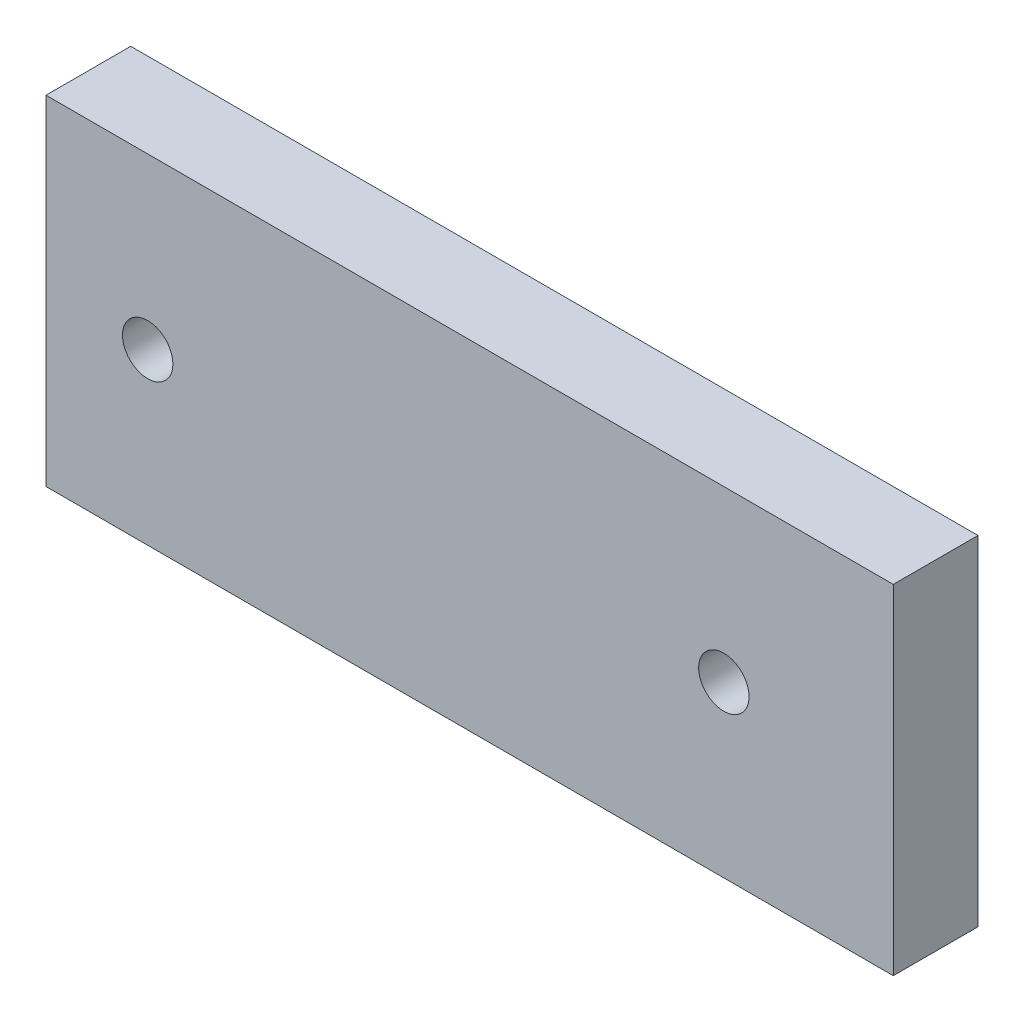
ISO-10303-21;
HEADER;
FILE_DESCRIPTION(('STEP AP214'),'2;1');
FILE_NAME('part.step','',(''),(''),'','','');
FILE_SCHEMA(('AUTOMOTIVE_DESIGN { 1 0 10303 214 1 1 1 1 }'));
ENDSEC;
DATA;
#1=APPLICATION_CONTEXT('core data for automotive mechanical design processes');
#2=APPLICATION_PROTOCOL_DEFINITION('international standard','automotive_design',2000,#1);
#3=PRODUCT_CONTEXT('',#1,'mechanical');
#4=PRODUCT('Part','Part','',(#3));
#5=PRODUCT_RELATED_PRODUCT_CATEGORY('part','',(#4));
#6=PRODUCT_DEFINITION_FORMATION('','',#4);
#7=PRODUCT_DEFINITION_CONTEXT('part definition',#1,'design');
#8=PRODUCT_DEFINITION('design','',#6,#7);
#9=PRODUCT_DEFINITION_SHAPE('','',#8);
#10=(LENGTH_UNIT() NAMED_UNIT(*) SI_UNIT(.MILLI.,.METRE.));
#11=(NAMED_UNIT(*) PLANE_ANGLE_UNIT() SI_UNIT($,.RADIAN.));
#12=(NAMED_UNIT(*) SI_UNIT($,.STERADIAN.) SOLID_ANGLE_UNIT());
#13=UNCERTAINTY_MEASURE_WITH_UNIT(LENGTH_MEASURE(1.E-05),#10,'distance_accuracy_value','');
#14=(GEOMETRIC_REPRESENTATION_CONTEXT(3) GLOBAL_UNCERTAINTY_ASSIGNED_CONTEXT((#13)) GLOBAL_UNIT_ASSIGNED_CONTEXT((#10,
#11,#12)) REPRESENTATION_CONTEXT('',''));
#15=CARTESIAN_POINT('',(0.,0.,0.));
#16=DIRECTION('',(0.,0.,1.));
#17=DIRECTION('',(1.,0.,0.));
#18=AXIS2_PLACEMENT_3D('',#15,#16,#17);
#19=CARTESIAN_POINT('',(-25.,10.,-5.));
#20=DIRECTION('',(-1.,0.,0.));
#21=DIRECTION('',(0.,0.,1.));
#22=AXIS2_PLACEMENT_3D('',#19,#20,#21);
#23=PLANE('',#22);
#24=DIRECTION('',(0.,-1.,0.));
#25=VECTOR('',#24,1.);
#26=CARTESIAN_POINT('',(-25.,10.,0.));
#27=LINE('',#26,#25);
#28=CARTESIAN_POINT('',(-25.,10.,0.));
#29=VERTEX_POINT('',#28);
#30=CARTESIAN_POINT('',(-25.,-10.,0.));
#31=VERTEX_POINT('',#30);
#32=EDGE_CURVE('E98',#29,#31,#27,.T.);
#33=ORIENTED_EDGE('',*,*,#32,.F.);
#34=DIRECTION('',(0.,0.,1.));
#35=VECTOR('',#34,1.);
#36=CARTESIAN_POINT('',(-25.,10.,-5.));
#37=LINE('',#36,#35);
#38=CARTESIAN_POINT('',(-25.,10.,-5.));
#39=VERTEX_POINT('',#38);
#40=EDGE_CURVE('E11',#39,#29,#37,.T.);
#41=ORIENTED_EDGE('',*,*,#40,.F.);
#42=DIRECTION('',(0.,-1.,0.));
#43=VECTOR('',#42,1.);
#44=CARTESIAN_POINT('',(-25.,10.,-5.));
#45=LINE('',#44,#43);
#46=CARTESIAN_POINT('',(-25.,-10.,-5.));
#47=VERTEX_POINT('',#46);
#48=EDGE_CURVE('E91',#39,#47,#45,.T.);
#49=ORIENTED_EDGE('',*,*,#48,.T.);
#50=DIRECTION('',(0.,0.,1.));
#51=VECTOR('',#50,1.);
#52=CARTESIAN_POINT('',(-25.,-10.,-5.));
#53=LINE('',#52,#51);
#54=EDGE_CURVE('E36',#47,#31,#53,.T.);
#55=ORIENTED_EDGE('',*,*,#54,.T.);
#56=EDGE_LOOP('',(#33,#41,#49,#55));
#57=FACE_BOUND('',#56,.T.);
#58=ADVANCED_FACE('F33',(#57),#23,.T.);
#59=CARTESIAN_POINT('',(-25.,10.,-5.));
#60=DIRECTION('',(0.,1.,0.));
#61=DIRECTION('',(-1.,0.,0.));
#62=AXIS2_PLACEMENT_3D('',#59,#60,#61);
#63=PLANE('',#62);
#64=DIRECTION('',(-1.,0.,0.));
#65=VECTOR('',#64,1.);
#66=CARTESIAN_POINT('',(-25.,10.,0.));
#67=LINE('',#66,#65);
#68=CARTESIAN_POINT('',(25.,10.,0.));
#69=VERTEX_POINT('',#68);
#70=EDGE_CURVE('E93',#69,#29,#67,.T.);
#71=ORIENTED_EDGE('',*,*,#70,.F.);
#72=DIRECTION('',(0.,0.,1.));
#73=VECTOR('',#72,1.);
#74=CARTESIAN_POINT('',(25.,10.,-5.));
#75=LINE('',#74,#73);
#76=CARTESIAN_POINT('',(25.,10.,-5.));
#77=VERTEX_POINT('',#76);
#78=EDGE_CURVE('E42',#77,#69,#75,.T.);
#79=ORIENTED_EDGE('',*,*,#78,.F.);
#80=DIRECTION('',(-1.,0.,0.));
#81=VECTOR('',#80,1.);
#82=CARTESIAN_POINT('',(-25.,10.,-5.));
#83=LINE('',#82,#81);
#84=EDGE_CURVE('E88',#77,#39,#83,.T.);
#85=ORIENTED_EDGE('',*,*,#84,.T.);
#86=ORIENTED_EDGE('',*,*,#40,.T.);
#87=EDGE_LOOP('',(#71,#79,#85,#86));
#88=FACE_BOUND('',#87,.T.);
#89=ADVANCED_FACE('F109',(#88),#63,.T.);
#90=CARTESIAN_POINT('',(25.,10.,-5.));
#91=DIRECTION('',(1.,0.,0.));
#92=DIRECTION('',(0.,0.,-1.));
#93=AXIS2_PLACEMENT_3D('',#90,#91,#92);
#94=PLANE('',#93);
#95=DIRECTION('',(0.,1.,0.));
#96=VECTOR('',#95,1.);
#97=CARTESIAN_POINT('',(25.,10.,0.));
#98=LINE('',#97,#96);
#99=CARTESIAN_POINT('',(25.,-10.,0.));
#100=VERTEX_POINT('',#99);
#101=EDGE_CURVE('E83',#100,#69,#98,.T.);
#102=ORIENTED_EDGE('',*,*,#101,.F.);
#103=DIRECTION('',(0.,0.,1.));
#104=VECTOR('',#103,1.);
#105=CARTESIAN_POINT('',(25.,-10.,-5.));
#106=LINE('',#105,#104);
#107=CARTESIAN_POINT('',(25.,-10.,-5.));
#108=VERTEX_POINT('',#107);
#109=EDGE_CURVE('E78',#108,#100,#106,.T.);
#110=ORIENTED_EDGE('',*,*,#109,.F.);
#111=DIRECTION('',(0.,1.,0.));
#112=VECTOR('',#111,1.);
#113=CARTESIAN_POINT('',(25.,10.,-5.));
#114=LINE('',#113,#112);
#115=EDGE_CURVE('E81',#108,#77,#114,.T.);
#116=ORIENTED_EDGE('',*,*,#115,.T.);
#117=ORIENTED_EDGE('',*,*,#78,.T.);
#118=EDGE_LOOP('',(#102,#110,#116,#117));
#119=FACE_BOUND('',#118,.T.);
#120=ADVANCED_FACE('F80',(#119),#94,.T.);
#121=CARTESIAN_POINT('',(-25.,-10.,-5.));
#122=DIRECTION('',(0.,-1.,0.));
#123=DIRECTION('',(1.,0.,0.));
#124=AXIS2_PLACEMENT_3D('',#121,#122,#123);
#125=PLANE('',#124);
#126=DIRECTION('',(1.,0.,0.));
#127=VECTOR('',#126,1.);
#128=CARTESIAN_POINT('',(-25.,-10.,0.));
#129=LINE('',#128,#127);
#130=EDGE_CURVE('E101',#31,#100,#129,.T.);
#131=ORIENTED_EDGE('',*,*,#130,.F.);
#132=ORIENTED_EDGE('',*,*,#54,.F.);
#133=DIRECTION('',(1.,0.,0.));
#134=VECTOR('',#133,1.);
#135=CARTESIAN_POINT('',(-25.,-10.,-5.));
#136=LINE('',#135,#134);
#137=EDGE_CURVE('E87',#47,#108,#136,.T.);
#138=ORIENTED_EDGE('',*,*,#137,.T.);
#139=ORIENTED_EDGE('',*,*,#109,.T.);
#140=EDGE_LOOP('',(#131,#132,#138,#139));
#141=FACE_BOUND('',#140,.T.);
#142=ADVANCED_FACE('F90',(#141),#125,.T.);
#143=CARTESIAN_POINT('',(0.,0.,-5.));
#144=DIRECTION('',(0.,0.,1.));
#145=DIRECTION('',(1.,0.,0.));
#146=AXIS2_PLACEMENT_3D('',#143,#144,#145);
#147=PLANE('',#146);
#148=CARTESIAN_POINT('',(15.,0.,-5.));
#149=DIRECTION('',(0.,0.,1.));
#150=DIRECTION('',(1.,0.,0.));
#151=AXIS2_PLACEMENT_3D('',#148,#149,#150);
#152=CIRCLE('',#151,1.48573677450417);
#153=CARTESIAN_POINT('',(16.4857367745042,0.,-5.));
#154=VERTEX_POINT('',#153);
#155=EDGE_CURVE('E142',#154,#154,#152,.T.);
#156=ORIENTED_EDGE('',*,*,#155,.T.);
#157=EDGE_LOOP('',(#156));
#158=FACE_BOUND('',#157,.T.);
#159=CARTESIAN_POINT('',(-19.,0.,-5.));
#160=DIRECTION('',(0.,0.,1.));
#161=DIRECTION('',(1.,0.,0.));
#162=AXIS2_PLACEMENT_3D('',#159,#160,#161);
#163=CIRCLE('',#162,1.48573677450417);
#164=CARTESIAN_POINT('',(-17.5142632254958,0.,-5.));
#165=VERTEX_POINT('',#164);
#166=EDGE_CURVE('E102',#165,#165,#163,.T.);
#167=ORIENTED_EDGE('',*,*,#166,.T.);
#168=EDGE_LOOP('',(#167));
#169=FACE_BOUND('',#168,.T.);
#170=ORIENTED_EDGE('',*,*,#48,.F.);
#171=ORIENTED_EDGE('',*,*,#84,.F.);
#172=ORIENTED_EDGE('',*,*,#115,.F.);
#173=ORIENTED_EDGE('',*,*,#137,.F.);
#174=EDGE_LOOP('',(#170,#171,#172,#173));
#175=FACE_BOUND('',#174,.T.);
#176=ADVANCED_FACE('F86',(#158,#169,#175),#147,.F.);
#177=CARTESIAN_POINT('',(0.,0.,0.));
#178=DIRECTION('',(0.,0.,1.));
#179=DIRECTION('',(1.,0.,0.));
#180=AXIS2_PLACEMENT_3D('',#177,#178,#179);
#181=PLANE('',#180);
#182=CARTESIAN_POINT('',(15.,0.,0.));
#183=DIRECTION('',(0.,0.,1.));
#184=DIRECTION('',(1.,0.,0.));
#185=AXIS2_PLACEMENT_3D('',#182,#183,#184);
#186=CIRCLE('',#185,1.48573677450417);
#187=CARTESIAN_POINT('',(16.4857367745042,0.,0.));
#188=VERTEX_POINT('',#187);
#189=EDGE_CURVE('E145',#188,#188,#186,.T.);
#190=ORIENTED_EDGE('',*,*,#189,.F.);
#191=EDGE_LOOP('',(#190));
#192=FACE_BOUND('',#191,.T.);
#193=CARTESIAN_POINT('',(-19.,0.,0.));
#194=DIRECTION('',(0.,0.,1.));
#195=DIRECTION('',(1.,0.,0.));
#196=AXIS2_PLACEMENT_3D('',#193,#194,#195);
#197=CIRCLE('',#196,1.48573677450417);
#198=CARTESIAN_POINT('',(-17.5142632254958,0.,0.));
#199=VERTEX_POINT('',#198);
#200=EDGE_CURVE('E147',#199,#199,#197,.T.);
#201=ORIENTED_EDGE('',*,*,#200,.F.);
#202=EDGE_LOOP('',(#201));
#203=FACE_BOUND('',#202,.T.);
#204=ORIENTED_EDGE('',*,*,#32,.T.);
#205=ORIENTED_EDGE('',*,*,#130,.T.);
#206=ORIENTED_EDGE('',*,*,#101,.T.);
#207=ORIENTED_EDGE('',*,*,#70,.T.);
#208=EDGE_LOOP('',(#204,#205,#206,#207));
#209=FACE_BOUND('',#208,.T.);
#210=ADVANCED_FACE('F108',(#192,#203,#209),#181,.T.);
#211=CARTESIAN_POINT('',(-19.,0.,-5.));
#212=DIRECTION('',(0.,0.,1.));
#213=DIRECTION('',(1.,0.,0.));
#214=AXIS2_PLACEMENT_3D('',#211,#212,#213);
#215=CYLINDRICAL_SURFACE('',#214,1.48573677450417);
#216=ORIENTED_EDGE('',*,*,#166,.F.);
#217=EDGE_LOOP('',(#216));
#218=FACE_BOUND('',#217,.T.);
#219=ORIENTED_EDGE('',*,*,#200,.T.);
#220=EDGE_LOOP('',(#219));
#221=FACE_BOUND('',#220,.T.);
#222=ADVANCED_FACE('F127',(#218,#221),#215,.F.);
#223=CARTESIAN_POINT('',(15.,0.,-5.));
#224=DIRECTION('',(0.,0.,1.));
#225=DIRECTION('',(1.,0.,0.));
#226=AXIS2_PLACEMENT_3D('',#223,#224,#225);
#227=CYLINDRICAL_SURFACE('',#226,1.48573677450417);
#228=ORIENTED_EDGE('',*,*,#155,.F.);
#229=EDGE_LOOP('',(#228));
#230=FACE_BOUND('',#229,.T.);
#231=ORIENTED_EDGE('',*,*,#189,.T.);
#232=EDGE_LOOP('',(#231));
#233=FACE_BOUND('',#232,.T.);
#234=ADVANCED_FACE('F134',(#230,#233),#227,.F.);
#235=CLOSED_SHELL('',(#58,#89,#120,#142,#176,#210,#222,#234));
#236=MANIFOLD_SOLID_BREP('B2',#235);
#237=ADVANCED_BREP_SHAPE_REPRESENTATION('',(#18,#236),#14);
#238=SHAPE_DEFINITION_REPRESENTATION(#9,#237);
ENDSEC;
END-ISO-10303-21;
